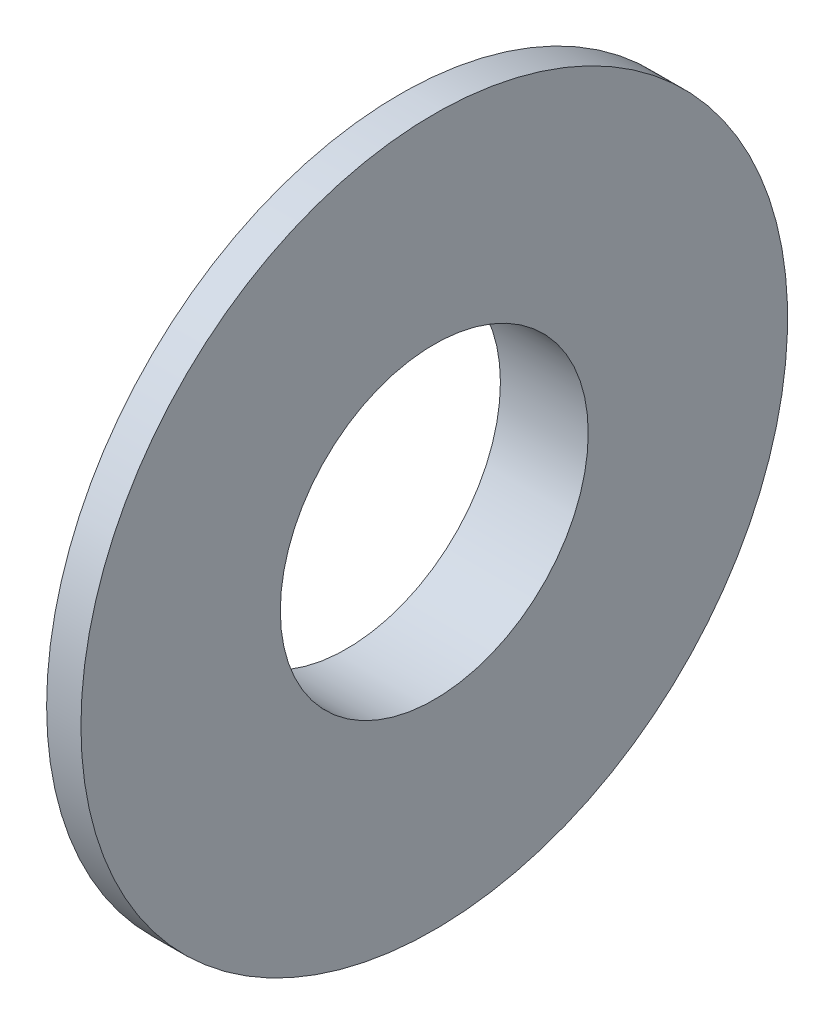
ISO-10303-21;
HEADER;
FILE_DESCRIPTION(('STEP AP214'),'2;1');
FILE_NAME('part.step','',(''),(''),'','','');
FILE_SCHEMA(('AUTOMOTIVE_DESIGN { 1 0 10303 214 1 1 1 1 }'));
ENDSEC;
DATA;
#1=APPLICATION_CONTEXT('core data for automotive mechanical design processes');
#2=APPLICATION_PROTOCOL_DEFINITION('international standard','automotive_design',2000,#1);
#3=PRODUCT_CONTEXT('',#1,'mechanical');
#4=PRODUCT('Part','Part','',(#3));
#5=PRODUCT_RELATED_PRODUCT_CATEGORY('part','',(#4));
#6=PRODUCT_DEFINITION_FORMATION('','',#4);
#7=PRODUCT_DEFINITION_CONTEXT('part definition',#1,'design');
#8=PRODUCT_DEFINITION('design','',#6,#7);
#9=PRODUCT_DEFINITION_SHAPE('','',#8);
#10=(LENGTH_UNIT() NAMED_UNIT(*) SI_UNIT(.MILLI.,.METRE.));
#11=(NAMED_UNIT(*) PLANE_ANGLE_UNIT() SI_UNIT($,.RADIAN.));
#12=(NAMED_UNIT(*) SI_UNIT($,.STERADIAN.) SOLID_ANGLE_UNIT());
#13=UNCERTAINTY_MEASURE_WITH_UNIT(LENGTH_MEASURE(1.E-05),#10,'distance_accuracy_value','');
#14=(GEOMETRIC_REPRESENTATION_CONTEXT(3) GLOBAL_UNCERTAINTY_ASSIGNED_CONTEXT((#13)) GLOBAL_UNIT_ASSIGNED_CONTEXT((#10,
#11,#12)) REPRESENTATION_CONTEXT('',''));
#15=CARTESIAN_POINT('',(0.,0.,0.));
#16=DIRECTION('',(0.,0.,1.));
#17=DIRECTION('',(1.,0.,0.));
#18=AXIS2_PLACEMENT_3D('',#15,#16,#17);
#19=CARTESIAN_POINT('',(-66.0934579439252,0.,0.));
#20=DIRECTION('',(-1.,0.,0.));
#21=DIRECTION('',(0.,0.,1.));
#22=AXIS2_PLACEMENT_3D('',#19,#20,#21);
#23=CYLINDRICAL_SURFACE('',#22,13.5);
#24=CARTESIAN_POINT('',(7.7,0.,0.));
#25=DIRECTION('',(-1.,0.,0.));
#26=DIRECTION('',(0.,0.,1.));
#27=AXIS2_PLACEMENT_3D('',#24,#25,#26);
#28=CIRCLE('',#27,13.5);
#29=CARTESIAN_POINT('',(7.7,0.,13.5));
#30=VERTEX_POINT('',#29);
#31=EDGE_CURVE('E60',#30,#30,#28,.T.);
#32=ORIENTED_EDGE('',*,*,#31,.F.);
#33=EDGE_LOOP('',(#32));
#34=FACE_BOUND('',#33,.T.);
#35=CARTESIAN_POINT('',(0.,0.,0.));
#36=DIRECTION('',(-1.,0.,0.));
#37=DIRECTION('',(0.,0.,1.));
#38=AXIS2_PLACEMENT_3D('',#35,#36,#37);
#39=CIRCLE('',#38,13.5);
#40=CARTESIAN_POINT('',(0.,0.,13.5));
#41=VERTEX_POINT('',#40);
#42=EDGE_CURVE('E10',#41,#41,#39,.T.);
#43=ORIENTED_EDGE('',*,*,#42,.T.);
#44=EDGE_LOOP('',(#43));
#45=FACE_BOUND('',#44,.T.);
#46=ADVANCED_FACE('F35',(#34,#45),#23,.F.);
#47=CARTESIAN_POINT('',(0.,13.5,0.));
#48=DIRECTION('',(1.,0.,0.));
#49=DIRECTION('',(0.,0.,-1.));
#50=AXIS2_PLACEMENT_3D('',#47,#48,#49);
#51=PLANE('',#50);
#52=ORIENTED_EDGE('',*,*,#42,.F.);
#53=EDGE_LOOP('',(#52));
#54=FACE_BOUND('',#53,.T.);
#55=CARTESIAN_POINT('',(0.,0.,0.));
#56=DIRECTION('',(-1.,0.,0.));
#57=DIRECTION('',(0.,0.,1.));
#58=AXIS2_PLACEMENT_3D('',#55,#56,#57);
#59=CIRCLE('',#58,20.0453070354953);
#60=CARTESIAN_POINT('',(0.,0.,20.0453070354953));
#61=VERTEX_POINT('',#60);
#62=EDGE_CURVE('E41',#61,#61,#59,.T.);
#63=ORIENTED_EDGE('',*,*,#62,.T.);
#64=EDGE_LOOP('',(#63));
#65=FACE_BOUND('',#64,.T.);
#66=ADVANCED_FACE('F67',(#54,#65),#51,.F.);
#67=CARTESIAN_POINT('',(-66.0934579439252,0.,0.));
#68=DIRECTION('',(-1.,0.,0.));
#69=DIRECTION('',(0.,0.,1.));
#70=AXIS2_PLACEMENT_3D('',#67,#68,#69);
#71=CYLINDRICAL_SURFACE('',#70,20.0453070354953);
#72=ORIENTED_EDGE('',*,*,#62,.F.);
#73=EDGE_LOOP('',(#72));
#74=FACE_BOUND('',#73,.T.);
#75=CARTESIAN_POINT('',(1.03155846483105,0.,0.));
#76=DIRECTION('',(-1.,0.,0.));
#77=DIRECTION('',(0.,0.,1.));
#78=AXIS2_PLACEMENT_3D('',#75,#76,#77);
#79=CIRCLE('',#78,20.0453070354953);
#80=CARTESIAN_POINT('',(1.03155846483105,0.,20.0453070354953));
#81=VERTEX_POINT('',#80);
#82=EDGE_CURVE('E45',#81,#81,#79,.T.);
#83=ORIENTED_EDGE('',*,*,#82,.T.);
#84=EDGE_LOOP('',(#83));
#85=FACE_BOUND('',#84,.T.);
#86=ADVANCED_FACE('F71',(#74,#85),#71,.T.);
#87=CARTESIAN_POINT('',(13.3785643871084,0.,0.));
#88=DIRECTION('',(-1.,0.,0.));
#89=DIRECTION('',(0.,0.,1.));
#90=AXIS2_PLACEMENT_3D('',#87,#88,#89);
#91=TOROIDAL_SURFACE('',#90,20.6699611187634,12.3627969314592);
#92=ORIENTED_EDGE('',*,*,#82,.F.);
#93=EDGE_LOOP('',(#92));
#94=FACE_BOUND('',#93,.T.);
#95=CARTESIAN_POINT('',(4.69108463983048,0.,0.));
#96=DIRECTION('',(-1.,0.,0.));
#97=DIRECTION('',(0.,0.,1.));
#98=AXIS2_PLACEMENT_3D('',#95,#96,#97);
#99=CIRCLE('',#98,29.4657807854648);
#100=CARTESIAN_POINT('',(4.69108463983048,0.,29.4657807854648));
#101=VERTEX_POINT('',#100);
#102=EDGE_CURVE('E49',#101,#101,#99,.T.);
#103=ORIENTED_EDGE('',*,*,#102,.T.);
#104=EDGE_LOOP('',(#103));
#105=FACE_BOUND('',#104,.T.);
#106=ADVANCED_FACE('F76',(#94,#105),#91,.T.);
#107=CARTESIAN_POINT('',(4.69108463983048,29.4657807854648,0.));
#108=DIRECTION('',(1.,0.,0.));
#109=DIRECTION('',(0.,0.,-1.));
#110=AXIS2_PLACEMENT_3D('',#107,#108,#109);
#111=PLANE('',#110);
#112=ORIENTED_EDGE('',*,*,#102,.F.);
#113=EDGE_LOOP('',(#112));
#114=FACE_BOUND('',#113,.T.);
#115=CARTESIAN_POINT('',(4.69108463983048,0.,0.));
#116=DIRECTION('',(-1.,0.,0.));
#117=DIRECTION('',(0.,0.,1.));
#118=AXIS2_PLACEMENT_3D('',#115,#116,#117);
#119=CIRCLE('',#118,30.981308411215);
#120=CARTESIAN_POINT('',(4.69108463983048,0.,30.981308411215));
#121=VERTEX_POINT('',#120);
#122=EDGE_CURVE('E54',#121,#121,#119,.T.);
#123=ORIENTED_EDGE('',*,*,#122,.T.);
#124=EDGE_LOOP('',(#123));
#125=FACE_BOUND('',#124,.T.);
#126=ADVANCED_FACE('F82',(#114,#125),#111,.F.);
#127=CARTESIAN_POINT('',(-66.0934579439252,0.,0.));
#128=DIRECTION('',(-1.,0.,0.));
#129=DIRECTION('',(0.,0.,1.));
#130=AXIS2_PLACEMENT_3D('',#127,#128,#129);
#131=CYLINDRICAL_SURFACE('',#130,30.981308411215);
#132=ORIENTED_EDGE('',*,*,#122,.F.);
#133=EDGE_LOOP('',(#132));
#134=FACE_BOUND('',#133,.T.);
#135=CARTESIAN_POINT('',(7.7,0.,0.));
#136=DIRECTION('',(-1.,0.,0.));
#137=DIRECTION('',(0.,0.,1.));
#138=AXIS2_PLACEMENT_3D('',#135,#136,#137);
#139=CIRCLE('',#138,30.981308411215);
#140=CARTESIAN_POINT('',(7.7,0.,30.981308411215));
#141=VERTEX_POINT('',#140);
#142=EDGE_CURVE('E57',#141,#141,#139,.T.);
#143=ORIENTED_EDGE('',*,*,#142,.T.);
#144=EDGE_LOOP('',(#143));
#145=FACE_BOUND('',#144,.T.);
#146=ADVANCED_FACE('F86',(#134,#145),#131,.T.);
#147=CARTESIAN_POINT('',(7.7,30.981308411215,0.));
#148=DIRECTION('',(-1.,0.,0.));
#149=DIRECTION('',(0.,0.,1.));
#150=AXIS2_PLACEMENT_3D('',#147,#148,#149);
#151=PLANE('',#150);
#152=ORIENTED_EDGE('',*,*,#142,.F.);
#153=EDGE_LOOP('',(#152));
#154=FACE_BOUND('',#153,.T.);
#155=ORIENTED_EDGE('',*,*,#31,.T.);
#156=EDGE_LOOP('',(#155));
#157=FACE_BOUND('',#156,.T.);
#158=ADVANCED_FACE('F64',(#154,#157),#151,.F.);
#159=CLOSED_SHELL('',(#46,#66,#86,#106,#126,#146,#158));
#160=MANIFOLD_SOLID_BREP('B2',#159);
#161=ADVANCED_BREP_SHAPE_REPRESENTATION('',(#18,#160),#14);
#162=SHAPE_DEFINITION_REPRESENTATION(#9,#161);
ENDSEC;
END-ISO-10303-21;
